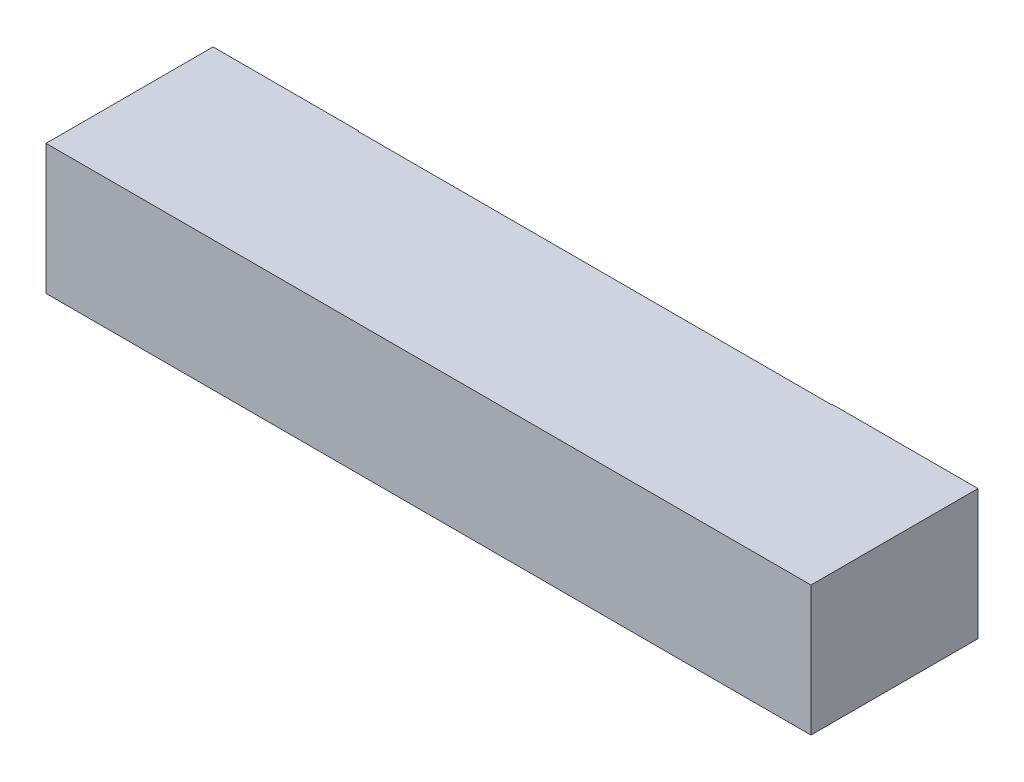
ISO-10303-21;
HEADER;
FILE_DESCRIPTION(('STEP AP214'),'2;1');
FILE_NAME('part.step','',(''),(''),'','','');
FILE_SCHEMA(('AUTOMOTIVE_DESIGN { 1 0 10303 214 1 1 1 1 }'));
ENDSEC;
DATA;
#1=APPLICATION_CONTEXT('core data for automotive mechanical design processes');
#2=APPLICATION_PROTOCOL_DEFINITION('international standard','automotive_design',2000,#1);
#3=PRODUCT_CONTEXT('',#1,'mechanical');
#4=PRODUCT('Part','Part','',(#3));
#5=PRODUCT_RELATED_PRODUCT_CATEGORY('part','',(#4));
#6=PRODUCT_DEFINITION_FORMATION('','',#4);
#7=PRODUCT_DEFINITION_CONTEXT('part definition',#1,'design');
#8=PRODUCT_DEFINITION('design','',#6,#7);
#9=PRODUCT_DEFINITION_SHAPE('','',#8);
#10=(LENGTH_UNIT() NAMED_UNIT(*) SI_UNIT(.MILLI.,.METRE.));
#11=(NAMED_UNIT(*) PLANE_ANGLE_UNIT() SI_UNIT($,.RADIAN.));
#12=(NAMED_UNIT(*) SI_UNIT($,.STERADIAN.) SOLID_ANGLE_UNIT());
#13=UNCERTAINTY_MEASURE_WITH_UNIT(LENGTH_MEASURE(1.E-05),#10,'distance_accuracy_value','');
#14=(GEOMETRIC_REPRESENTATION_CONTEXT(3) GLOBAL_UNCERTAINTY_ASSIGNED_CONTEXT((#13)) GLOBAL_UNIT_ASSIGNED_CONTEXT((#10,
#11,#12)) REPRESENTATION_CONTEXT('',''));
#15=CARTESIAN_POINT('',(0.,0.,0.));
#16=DIRECTION('',(0.,0.,1.));
#17=DIRECTION('',(1.,0.,0.));
#18=AXIS2_PLACEMENT_3D('',#15,#16,#17);
#19=CARTESIAN_POINT('',(49.177500772395,83.060001242994,0.));
#20=DIRECTION('',(-1.74845553702097E-07,0.999999999999985,0.));
#21=DIRECTION('',(-0.999999999999985,-1.74845553702097E-07,0.));
#22=AXIS2_PLACEMENT_3D('',#19,#20,#21);
#23=PLANE('',#22);
#24=DIRECTION('',(1.,0.,0.));
#25=VECTOR('',#24,1.);
#26=CARTESIAN_POINT('',(45.50000122,83.059999957005,1.8));
#27=LINE('',#26,#25);
#28=CARTESIAN_POINT('',(41.8225008816735,83.059999957005,1.8));
#29=VERTEX_POINT('',#28);
#30=CARTESIAN_POINT('',(49.1775007723952,83.0600009214968,1.8));
#31=VERTEX_POINT('',#30);
#32=EDGE_CURVE('E104',#29,#31,#27,.T.);
#33=ORIENTED_EDGE('',*,*,#32,.T.);
#34=DIRECTION('',(0.,0.,1.));
#35=VECTOR('',#34,1.);
#36=CARTESIAN_POINT('',(49.1775007723958,83.060001242994,0.));
#37=LINE('',#36,#35);
#38=CARTESIAN_POINT('',(49.1775007723952,83.0600011206025,0.193910852317));
#39=VERTEX_POINT('',#38);
#40=EDGE_CURVE('E93',#39,#31,#37,.T.);
#41=ORIENTED_EDGE('',*,*,#40,.F.);
#42=DIRECTION('',(1.,0.,0.));
#43=VECTOR('',#42,1.);
#44=CARTESIAN_POINT('',(41.822500772395,83.060000998211,0.193910852317));
#45=LINE('',#44,#43);
#46=CARTESIAN_POINT('',(47.7775008270346,83.0600009982108,0.193910852317));
#47=VERTEX_POINT('',#46);
#48=EDGE_CURVE('E80',#47,#39,#45,.T.);
#49=ORIENTED_EDGE('',*,*,#48,.F.);
#50=DIRECTION('',(0.,0.,1.));
#51=VECTOR('',#50,1.);
#52=CARTESIAN_POINT('',(47.7775007723958,83.060000998211,0.));
#53=LINE('',#52,#51);
#54=CARTESIAN_POINT('',(47.7775008270346,83.0600009982108,0.2));
#55=VERTEX_POINT('',#54);
#56=EDGE_CURVE('E20',#47,#55,#53,.T.);
#57=ORIENTED_EDGE('',*,*,#56,.T.);
#58=DIRECTION('',(1.,0.,0.));
#59=VECTOR('',#58,1.);
#60=CARTESIAN_POINT('',(45.50000122,83.060000998211,0.2));
#61=LINE('',#60,#59);
#62=CARTESIAN_POINT('',(43.222500772395,83.0600004008944,0.2));
#63=VERTEX_POINT('',#62);
#64=EDGE_CURVE('E124',#55,#63,#61,.F.);
#65=ORIENTED_EDGE('',*,*,#64,.T.);
#66=DIRECTION('',(0.,0.,1.));
#67=VECTOR('',#66,1.);
#68=CARTESIAN_POINT('',(43.222500772395,83.060000201789,0.));
#69=LINE('',#68,#67);
#70=CARTESIAN_POINT('',(43.222500772395,83.0600001405929,0.193910852317));
#71=VERTEX_POINT('',#70);
#72=EDGE_CURVE('E119',#63,#71,#69,.F.);
#73=ORIENTED_EDGE('',*,*,#72,.T.);
#74=DIRECTION('',(1.,0.,0.));
#75=VECTOR('',#74,1.);
#76=CARTESIAN_POINT('',(41.822500772395,83.059999957005,0.193910852317));
#77=LINE('',#76,#75);
#78=CARTESIAN_POINT('',(41.8225008270343,83.059999957005,0.193910852317));
#79=VERTEX_POINT('',#78);
#80=EDGE_CURVE('E116',#79,#71,#77,.T.);
#81=ORIENTED_EDGE('',*,*,#80,.F.);
#82=DIRECTION('',(0.,0.,1.));
#83=VECTOR('',#82,1.);
#84=CARTESIAN_POINT('',(41.822500772395,83.059999957005,0.));
#85=LINE('',#84,#83);
#86=EDGE_CURVE('E111',#29,#79,#85,.F.);
#87=ORIENTED_EDGE('',*,*,#86,.F.);
#88=EDGE_LOOP('',(#33,#41,#49,#57,#65,#73,#81,#87));
#89=FACE_BOUND('',#88,.T.);
#90=ADVANCED_FACE('F17',(#89),#23,.T.);
#91=CARTESIAN_POINT('',(47.777501667605,77.940000998211,0.));
#92=DIRECTION('',(0.999999999999985,1.74845553702097E-07,0.));
#93=DIRECTION('',(-1.74845553702097E-07,0.999999999999985,0.));
#94=AXIS2_PLACEMENT_3D('',#91,#92,#93);
#95=PLANE('',#94);
#96=DIRECTION('',(0.,-1.,0.));
#97=VECTOR('',#96,1.);
#98=CARTESIAN_POINT('',(47.777500990952,80.5000006,0.2));
#99=LINE('',#98,#97);
#100=CARTESIAN_POINT('',(47.7775009909524,81.8100007991054,0.2));
#101=VERTEX_POINT('',#100);
#102=EDGE_CURVE('E89',#101,#55,#99,.F.);
#103=ORIENTED_EDGE('',*,*,#102,.T.);
#104=ORIENTED_EDGE('',*,*,#56,.F.);
#105=DIRECTION('',(0.,1.,0.));
#106=VECTOR('',#105,1.);
#107=CARTESIAN_POINT('',(47.777500990952,83.059999957005,0.193910852317));
#108=LINE('',#107,#106);
#109=CARTESIAN_POINT('',(47.7775009909524,81.8100010594069,0.193910852317));
#110=VERTEX_POINT('',#109);
#111=EDGE_CURVE('E86',#110,#47,#108,.T.);
#112=ORIENTED_EDGE('',*,*,#111,.F.);
#113=DIRECTION('',(0.,0.,1.));
#114=VECTOR('',#113,1.);
#115=CARTESIAN_POINT('',(47.777500990952,81.8100009982107,0.996955426159));
#116=LINE('',#115,#114);
#117=EDGE_CURVE('E127',#101,#110,#116,.F.);
#118=ORIENTED_EDGE('',*,*,#117,.F.);
#119=EDGE_LOOP('',(#103,#104,#112,#118));
#120=FACE_BOUND('',#119,.T.);
#121=ADVANCED_FACE('F85',(#120),#95,.F.);
#122=CARTESIAN_POINT('',(41.822500772395,83.059999957005,0.193910852317));
#123=DIRECTION('',(0.,0.,-1.));
#124=DIRECTION('',(0.,1.,0.));
#125=AXIS2_PLACEMENT_3D('',#122,#123,#124);
#126=PLANE('',#125);
#127=DIRECTION('',(-1.74845553702097E-07,0.999999999999985,0.));
#128=VECTOR('',#127,1.);
#129=CARTESIAN_POINT('',(49.177501667605,77.940001242995,0.193910852317));
#130=LINE('',#129,#128);
#131=CARTESIAN_POINT('',(49.1775008816737,81.8100012429949,0.193910852317));
#132=VERTEX_POINT('',#131);
#133=EDGE_CURVE('E95',#132,#39,#130,.T.);
#134=ORIENTED_EDGE('',*,*,#133,.F.);
#135=DIRECTION('',(0.999999999999985,1.74845553702097E-07,0.));
#136=VECTOR('',#135,1.);
#137=CARTESIAN_POINT('',(45.500000990952,81.8100006,0.193910852317));
#138=LINE('',#137,#136);
#139=EDGE_CURVE('E99',#110,#132,#138,.T.);
#140=ORIENTED_EDGE('',*,*,#139,.F.);
#141=ORIENTED_EDGE('',*,*,#111,.T.);
#142=ORIENTED_EDGE('',*,*,#48,.T.);
#143=EDGE_LOOP('',(#134,#140,#141,#142));
#144=FACE_BOUND('',#143,.T.);
#145=ADVANCED_FACE('F97',(#144),#126,.T.);
#146=CARTESIAN_POINT('',(49.177501667605,77.940001242995,0.));
#147=DIRECTION('',(0.999999999999985,1.74845553702097E-07,0.));
#148=DIRECTION('',(-1.74845553702097E-07,0.999999999999985,0.));
#149=AXIS2_PLACEMENT_3D('',#146,#147,#148);
#150=PLANE('',#149);
#151=DIRECTION('',(0.,1.,0.));
#152=VECTOR('',#151,1.);
#153=CARTESIAN_POINT('',(49.177500772395,80.5000006,1.8));
#154=LINE('',#153,#152);
#155=CARTESIAN_POINT('',(49.1775009363131,81.8100012429949,1.8));
#156=VERTEX_POINT('',#155);
#157=EDGE_CURVE('E106',#31,#156,#154,.F.);
#158=ORIENTED_EDGE('',*,*,#157,.T.);
#159=DIRECTION('',(0.,0.,1.));
#160=VECTOR('',#159,1.);
#161=CARTESIAN_POINT('',(49.177500990952,81.8100012429945,0.996955426159));
#162=LINE('',#161,#160);
#163=EDGE_CURVE('E130',#132,#156,#162,.T.);
#164=ORIENTED_EDGE('',*,*,#163,.F.);
#165=ORIENTED_EDGE('',*,*,#133,.T.);
#166=ORIENTED_EDGE('',*,*,#40,.T.);
#167=EDGE_LOOP('',(#158,#164,#165,#166));
#168=FACE_BOUND('',#167,.T.);
#169=ADVANCED_FACE('F173',(#168),#150,.T.);
#170=CARTESIAN_POINT('',(45.50000122,80.5000006,1.8));
#171=DIRECTION('',(0.,0.,-1.));
#172=DIRECTION('',(0.,1.,0.));
#173=AXIS2_PLACEMENT_3D('',#170,#171,#172);
#174=PLANE('',#173);
#175=ORIENTED_EDGE('',*,*,#157,.F.);
#176=ORIENTED_EDGE('',*,*,#32,.F.);
#177=DIRECTION('',(1.74845553702097E-07,-0.999999999999985,0.));
#178=VECTOR('',#177,1.);
#179=CARTESIAN_POINT('',(41.822500772395,83.059999957005,1.8));
#180=LINE('',#179,#178);
#181=CARTESIAN_POINT('',(41.822500990952,81.8100006000001,1.8));
#182=VERTEX_POINT('',#181);
#183=EDGE_CURVE('E108',#182,#29,#180,.F.);
#184=ORIENTED_EDGE('',*,*,#183,.F.);
#185=DIRECTION('',(0.999999999999985,1.74845553702097E-07,0.));
#186=VECTOR('',#185,1.);
#187=CARTESIAN_POINT('',(45.500000990952,81.8100006,1.8));
#188=LINE('',#187,#186);
#189=EDGE_CURVE('E133',#156,#182,#188,.F.);
#190=ORIENTED_EDGE('',*,*,#189,.F.);
#191=EDGE_LOOP('',(#175,#176,#184,#190));
#192=FACE_BOUND('',#191,.T.);
#193=ADVANCED_FACE('F169',(#192),#174,.F.);
#194=CARTESIAN_POINT('',(41.822500772395,83.059999957005,0.));
#195=DIRECTION('',(-0.999999999999985,-1.74845553702097E-07,0.));
#196=DIRECTION('',(1.74845553702097E-07,-0.999999999999985,0.));
#197=AXIS2_PLACEMENT_3D('',#194,#195,#196);
#198=PLANE('',#197);
#199=ORIENTED_EDGE('',*,*,#183,.T.);
#200=ORIENTED_EDGE('',*,*,#86,.T.);
#201=DIRECTION('',(0.,1.,0.));
#202=VECTOR('',#201,1.);
#203=CARTESIAN_POINT('',(41.822500990952,83.059999957005,0.193910852317));
#204=LINE('',#203,#202);
#205=CARTESIAN_POINT('',(41.822500990952,81.8100000182011,0.193910852317));
#206=VERTEX_POINT('',#205);
#207=EDGE_CURVE('E113',#206,#79,#204,.T.);
#208=ORIENTED_EDGE('',*,*,#207,.F.);
#209=DIRECTION('',(0.,0.,1.));
#210=VECTOR('',#209,1.);
#211=CARTESIAN_POINT('',(41.822500990952,81.8099999570055,0.996955426159));
#212=LINE('',#211,#210);
#213=EDGE_CURVE('E136',#182,#206,#212,.F.);
#214=ORIENTED_EDGE('',*,*,#213,.F.);
#215=EDGE_LOOP('',(#199,#200,#208,#214));
#216=FACE_BOUND('',#215,.T.);
#217=ADVANCED_FACE('F166',(#216),#198,.T.);
#218=CARTESIAN_POINT('',(41.822500772395,83.059999957005,0.193910852317));
#219=DIRECTION('',(0.,0.,-1.));
#220=DIRECTION('',(0.,1.,0.));
#221=AXIS2_PLACEMENT_3D('',#218,#219,#220);
#222=PLANE('',#221);
#223=ORIENTED_EDGE('',*,*,#207,.T.);
#224=ORIENTED_EDGE('',*,*,#80,.T.);
#225=DIRECTION('',(1.74845553702097E-07,-0.999999999999985,0.));
#226=VECTOR('',#225,1.);
#227=CARTESIAN_POINT('',(43.222500772395,83.060000201789,0.193910852317));
#228=LINE('',#227,#226);
#229=CARTESIAN_POINT('',(43.2225008816735,81.8100002017891,0.193910852317));
#230=VERTEX_POINT('',#229);
#231=EDGE_CURVE('E121',#71,#230,#228,.T.);
#232=ORIENTED_EDGE('',*,*,#231,.T.);
#233=DIRECTION('',(0.999999999999985,1.74845553702097E-07,0.));
#234=VECTOR('',#233,1.);
#235=CARTESIAN_POINT('',(45.500000990952,81.8100006,0.193910852317));
#236=LINE('',#235,#234);
#237=EDGE_CURVE('E139',#206,#230,#236,.T.);
#238=ORIENTED_EDGE('',*,*,#237,.F.);
#239=EDGE_LOOP('',(#223,#224,#232,#238));
#240=FACE_BOUND('',#239,.T.);
#241=ADVANCED_FACE('F149',(#240),#222,.T.);
#242=CARTESIAN_POINT('',(43.222500772395,83.060000201789,0.));
#243=DIRECTION('',(-0.999999999999985,-1.74845553702097E-07,0.));
#244=DIRECTION('',(1.74845553702097E-07,-0.999999999999985,0.));
#245=AXIS2_PLACEMENT_3D('',#242,#243,#244);
#246=PLANE('',#245);
#247=ORIENTED_EDGE('',*,*,#231,.F.);
#248=ORIENTED_EDGE('',*,*,#72,.F.);
#249=DIRECTION('',(0.,-1.,0.));
#250=VECTOR('',#249,1.);
#251=CARTESIAN_POINT('',(43.222500772395,80.5000006,0.2));
#252=LINE('',#251,#250);
#253=CARTESIAN_POINT('',(43.2225009363127,81.8100002017891,0.2));
#254=VERTEX_POINT('',#253);
#255=EDGE_CURVE('E35',#63,#254,#252,.T.);
#256=ORIENTED_EDGE('',*,*,#255,.T.);
#257=DIRECTION('',(0.,0.,1.));
#258=VECTOR('',#257,1.);
#259=CARTESIAN_POINT('',(43.222500990952,81.8100002017893,0.996955426159));
#260=LINE('',#259,#258);
#261=EDGE_CURVE('E26',#230,#254,#260,.T.);
#262=ORIENTED_EDGE('',*,*,#261,.F.);
#263=EDGE_LOOP('',(#247,#248,#256,#262));
#264=FACE_BOUND('',#263,.T.);
#265=ADVANCED_FACE('F147',(#264),#246,.F.);
#266=CARTESIAN_POINT('',(45.50000122,80.5000006,0.2));
#267=DIRECTION('',(0.,0.,1.));
#268=DIRECTION('',(0.,-1.,0.));
#269=AXIS2_PLACEMENT_3D('',#266,#267,#268);
#270=PLANE('',#269);
#271=ORIENTED_EDGE('',*,*,#255,.F.);
#272=ORIENTED_EDGE('',*,*,#64,.F.);
#273=ORIENTED_EDGE('',*,*,#102,.F.);
#274=DIRECTION('',(0.999999999999985,1.74845553702097E-07,0.));
#275=VECTOR('',#274,1.);
#276=CARTESIAN_POINT('',(45.500000990952,81.8100006,0.2));
#277=LINE('',#276,#275);
#278=EDGE_CURVE('E11',#254,#101,#277,.T.);
#279=ORIENTED_EDGE('',*,*,#278,.F.);
#280=EDGE_LOOP('',(#271,#272,#273,#279));
#281=FACE_BOUND('',#280,.T.);
#282=ADVANCED_FACE('F153',(#281),#270,.F.);
#283=CARTESIAN_POINT('',(45.500000990952,81.8100006,0.996955426159));
#284=DIRECTION('',(1.74845553702097E-07,-0.999999999999985,0.));
#285=DIRECTION('',(0.999999999999985,1.74845553702097E-07,0.));
#286=AXIS2_PLACEMENT_3D('',#283,#284,#285);
#287=PLANE('',#286);
#288=ORIENTED_EDGE('',*,*,#261,.T.);
#289=ORIENTED_EDGE('',*,*,#278,.T.);
#290=ORIENTED_EDGE('',*,*,#117,.T.);
#291=ORIENTED_EDGE('',*,*,#139,.T.);
#292=ORIENTED_EDGE('',*,*,#163,.T.);
#293=ORIENTED_EDGE('',*,*,#189,.T.);
#294=ORIENTED_EDGE('',*,*,#213,.T.);
#295=ORIENTED_EDGE('',*,*,#237,.T.);
#296=EDGE_LOOP('',(#288,#289,#290,#291,#292,#293,#294,#295));
#297=FACE_BOUND('',#296,.T.);
#298=ADVANCED_FACE('F144',(#297),#287,.T.);
#299=CLOSED_SHELL('',(#90,#121,#145,#169,#193,#217,#241,#265,#282,#298));
#300=MANIFOLD_SOLID_BREP('B1',#299);
#301=ADVANCED_BREP_SHAPE_REPRESENTATION('',(#18,#300),#14);
#302=SHAPE_DEFINITION_REPRESENTATION(#9,#301);
ENDSEC;
END-ISO-10303-21;
